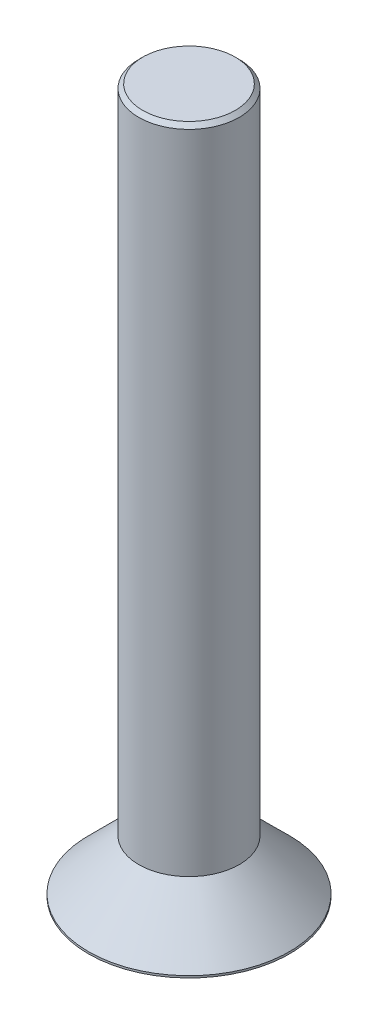
ISO-10303-21;
HEADER;
FILE_DESCRIPTION(('STEP AP214'),'2;1');
FILE_NAME('part.step','',(''),(''),'','','');
FILE_SCHEMA(('AUTOMOTIVE_DESIGN { 1 0 10303 214 1 1 1 1 }'));
ENDSEC;
DATA;
#1=APPLICATION_CONTEXT('core data for automotive mechanical design processes');
#2=APPLICATION_PROTOCOL_DEFINITION('international standard','automotive_design',2000,#1);
#3=PRODUCT_CONTEXT('',#1,'mechanical');
#4=PRODUCT('Part','Part','',(#3));
#5=PRODUCT_RELATED_PRODUCT_CATEGORY('part','',(#4));
#6=PRODUCT_DEFINITION_FORMATION('','',#4);
#7=PRODUCT_DEFINITION_CONTEXT('part definition',#1,'design');
#8=PRODUCT_DEFINITION('design','',#6,#7);
#9=PRODUCT_DEFINITION_SHAPE('','',#8);
#10=(LENGTH_UNIT() NAMED_UNIT(*) SI_UNIT(.MILLI.,.METRE.));
#11=(NAMED_UNIT(*) PLANE_ANGLE_UNIT() SI_UNIT($,.RADIAN.));
#12=(NAMED_UNIT(*) SI_UNIT($,.STERADIAN.) SOLID_ANGLE_UNIT());
#13=UNCERTAINTY_MEASURE_WITH_UNIT(LENGTH_MEASURE(1.E-05),#10,'distance_accuracy_value','');
#14=(GEOMETRIC_REPRESENTATION_CONTEXT(3) GLOBAL_UNCERTAINTY_ASSIGNED_CONTEXT((#13)) GLOBAL_UNIT_ASSIGNED_CONTEXT((#10,
#11,#12)) REPRESENTATION_CONTEXT('',''));
#15=CARTESIAN_POINT('',(0.,0.,0.));
#16=DIRECTION('',(0.,0.,1.));
#17=DIRECTION('',(1.,0.,0.));
#18=AXIS2_PLACEMENT_3D('',#15,#16,#17);
#19=CARTESIAN_POINT('',(0.,2.6,0.));
#20=DIRECTION('',(0.,-1.,0.));
#21=DIRECTION('',(0.,0.,-1.));
#22=AXIS2_PLACEMENT_3D('',#19,#20,#21);
#23=CYLINDRICAL_SURFACE('',#22,5.);
#24=CARTESIAN_POINT('',(0.,0.0999999999999916,0.));
#25=DIRECTION('',(0.,1.,0.));
#26=DIRECTION('',(0.,0.,1.));
#27=AXIS2_PLACEMENT_3D('',#24,#25,#26);
#28=CIRCLE('',#27,5.);
#29=CARTESIAN_POINT('',(0.,0.0999999999999916,5.));
#30=VERTEX_POINT('',#29);
#31=EDGE_CURVE('E151',#30,#30,#28,.F.);
#32=ORIENTED_EDGE('',*,*,#31,.T.);
#33=EDGE_LOOP('',(#32));
#34=FACE_BOUND('',#33,.T.);
#35=CARTESIAN_POINT('',(0.,0.,0.));
#36=DIRECTION('',(0.,1.,0.));
#37=DIRECTION('',(0.,0.,1.));
#38=AXIS2_PLACEMENT_3D('',#35,#36,#37);
#39=CIRCLE('',#38,5.);
#40=CARTESIAN_POINT('',(0.,0.,5.));
#41=VERTEX_POINT('',#40);
#42=EDGE_CURVE('E140',#41,#41,#39,.T.);
#43=ORIENTED_EDGE('',*,*,#42,.T.);
#44=EDGE_LOOP('',(#43));
#45=FACE_BOUND('',#44,.T.);
#46=ADVANCED_FACE('F37',(#34,#45),#23,.T.);
#47=CARTESIAN_POINT('',(0.,0.,0.));
#48=DIRECTION('',(0.,1.,0.));
#49=DIRECTION('',(0.,0.,1.));
#50=AXIS2_PLACEMENT_3D('',#47,#48,#49);
#51=PLANE('',#50);
#52=DIRECTION('',(0.,0.,1.));
#53=VECTOR('',#52,1.);
#54=CARTESIAN_POINT('',(1.54,0.,-0.889119414552024));
#55=LINE('',#54,#53);
#56=CARTESIAN_POINT('',(1.54,0.,-0.889119414552024));
#57=VERTEX_POINT('',#56);
#58=CARTESIAN_POINT('',(1.54,0.,0.889119414552024));
#59=VERTEX_POINT('',#58);
#60=EDGE_CURVE('E127',#57,#59,#55,.T.);
#61=ORIENTED_EDGE('',*,*,#60,.F.);
#62=DIRECTION('',(0.866025403784439,0.,0.5));
#63=VECTOR('',#62,1.);
#64=CARTESIAN_POINT('',(0.,0.,-1.77823882910405));
#65=LINE('',#64,#63);
#66=CARTESIAN_POINT('',(0.,0.,-1.77823882910405));
#67=VERTEX_POINT('',#66);
#68=EDGE_CURVE('E53',#67,#57,#65,.T.);
#69=ORIENTED_EDGE('',*,*,#68,.F.);
#70=DIRECTION('',(0.866025403784438,0.,-0.5));
#71=VECTOR('',#70,1.);
#72=CARTESIAN_POINT('',(-1.54,0.,-0.889119414552024));
#73=LINE('',#72,#71);
#74=CARTESIAN_POINT('',(-1.54,0.,-0.889119414552024));
#75=VERTEX_POINT('',#74);
#76=EDGE_CURVE('E136',#75,#67,#73,.T.);
#77=ORIENTED_EDGE('',*,*,#76,.F.);
#78=DIRECTION('',(0.,0.,-1.));
#79=VECTOR('',#78,1.);
#80=CARTESIAN_POINT('',(-1.54,0.,0.889119414552024));
#81=LINE('',#80,#79);
#82=CARTESIAN_POINT('',(-1.54,0.,0.889119414552024));
#83=VERTEX_POINT('',#82);
#84=EDGE_CURVE('E134',#83,#75,#81,.T.);
#85=ORIENTED_EDGE('',*,*,#84,.F.);
#86=DIRECTION('',(-0.866025403784439,0.,-0.5));
#87=VECTOR('',#86,1.);
#88=CARTESIAN_POINT('',(0.,0.,1.77823882910405));
#89=LINE('',#88,#87);
#90=CARTESIAN_POINT('',(0.,0.,1.77823882910405));
#91=VERTEX_POINT('',#90);
#92=EDGE_CURVE('E101',#91,#83,#89,.T.);
#93=ORIENTED_EDGE('',*,*,#92,.F.);
#94=DIRECTION('',(-0.866025403784439,0.,0.5));
#95=VECTOR('',#94,1.);
#96=CARTESIAN_POINT('',(1.54,0.,0.889119414552024));
#97=LINE('',#96,#95);
#98=EDGE_CURVE('E130',#59,#91,#97,.T.);
#99=ORIENTED_EDGE('',*,*,#98,.F.);
#100=EDGE_LOOP('',(#61,#69,#77,#85,#93,#99));
#101=FACE_BOUND('',#100,.T.);
#102=ORIENTED_EDGE('',*,*,#42,.F.);
#103=EDGE_LOOP('',(#102));
#104=FACE_BOUND('',#103,.T.);
#105=ADVANCED_FACE('F167',(#101,#104),#51,.F.);
#106=CARTESIAN_POINT('',(0.,2.6,0.));
#107=DIRECTION('',(0.,-1.,0.));
#108=DIRECTION('',(0.,0.,-1.));
#109=AXIS2_PLACEMENT_3D('',#106,#107,#108);
#110=CONICAL_SURFACE('',#109,2.5,0.785398163397447);
#111=ORIENTED_EDGE('',*,*,#31,.F.);
#112=EDGE_LOOP('',(#111));
#113=FACE_BOUND('',#112,.T.);
#114=CARTESIAN_POINT('',(0.,2.6,0.));
#115=DIRECTION('',(0.,1.,0.));
#116=DIRECTION('',(0.,0.,1.));
#117=AXIS2_PLACEMENT_3D('',#114,#115,#116);
#118=CIRCLE('',#117,2.5);
#119=CARTESIAN_POINT('',(0.,2.6,2.5));
#120=VERTEX_POINT('',#119);
#121=EDGE_CURVE('E148',#120,#120,#118,.T.);
#122=ORIENTED_EDGE('',*,*,#121,.F.);
#123=EDGE_LOOP('',(#122));
#124=FACE_BOUND('',#123,.T.);
#125=ADVANCED_FACE('F173',(#113,#124),#110,.T.);
#126=CARTESIAN_POINT('',(0.,0.95,-1.77823882910405));
#127=DIRECTION('',(0.5,0.,-0.866025403784439));
#128=DIRECTION('',(-0.866025403784439,0.,-0.5));
#129=AXIS2_PLACEMENT_3D('',#126,#127,#128);
#130=PLANE('',#129);
#131=ORIENTED_EDGE('',*,*,#68,.T.);
#132=DIRECTION('',(0.,-1.,0.));
#133=VECTOR('',#132,1.);
#134=CARTESIAN_POINT('',(1.54,0.95,-0.889119414552024));
#135=LINE('',#134,#133);
#136=CARTESIAN_POINT('',(1.54,0.95,-0.889119414552024));
#137=VERTEX_POINT('',#136);
#138=EDGE_CURVE('E83',#137,#57,#135,.T.);
#139=ORIENTED_EDGE('',*,*,#138,.F.);
#140=DIRECTION('',(0.866025403784439,0.,0.5));
#141=VECTOR('',#140,1.);
#142=CARTESIAN_POINT('',(0.,0.95,-1.77823882910405));
#143=LINE('',#142,#141);
#144=CARTESIAN_POINT('',(0.,0.95,-1.77823882910405));
#145=VERTEX_POINT('',#144);
#146=EDGE_CURVE('E138',#145,#137,#143,.T.);
#147=ORIENTED_EDGE('',*,*,#146,.F.);
#148=DIRECTION('',(0.,-1.,0.));
#149=VECTOR('',#148,1.);
#150=CARTESIAN_POINT('',(0.,0.95,-1.77823882910405));
#151=LINE('',#150,#149);
#152=EDGE_CURVE('E61',#145,#67,#151,.T.);
#153=ORIENTED_EDGE('',*,*,#152,.T.);
#154=EDGE_LOOP('',(#131,#139,#147,#153));
#155=FACE_BOUND('',#154,.T.);
#156=ADVANCED_FACE('F182',(#155),#130,.F.);
#157=CARTESIAN_POINT('',(-1.54,0.95,-0.889119414552024));
#158=DIRECTION('',(-0.5,0.,-0.866025403784439));
#159=DIRECTION('',(-0.866025403784439,0.,0.5));
#160=AXIS2_PLACEMENT_3D('',#157,#158,#159);
#161=PLANE('',#160);
#162=ORIENTED_EDGE('',*,*,#76,.T.);
#163=ORIENTED_EDGE('',*,*,#152,.F.);
#164=DIRECTION('',(0.866025403784438,0.,-0.5));
#165=VECTOR('',#164,1.);
#166=CARTESIAN_POINT('',(-1.54,0.95,-0.889119414552024));
#167=LINE('',#166,#165);
#168=CARTESIAN_POINT('',(-1.54,0.95,-0.889119414552024));
#169=VERTEX_POINT('',#168);
#170=EDGE_CURVE('E113',#169,#145,#167,.T.);
#171=ORIENTED_EDGE('',*,*,#170,.F.);
#172=DIRECTION('',(0.,-1.,0.));
#173=VECTOR('',#172,1.);
#174=CARTESIAN_POINT('',(-1.54,0.95,-0.889119414552024));
#175=LINE('',#174,#173);
#176=EDGE_CURVE('E105',#169,#75,#175,.T.);
#177=ORIENTED_EDGE('',*,*,#176,.T.);
#178=EDGE_LOOP('',(#162,#163,#171,#177));
#179=FACE_BOUND('',#178,.T.);
#180=ADVANCED_FACE('F187',(#179),#161,.F.);
#181=CARTESIAN_POINT('',(-1.54,0.95,0.889119414552024));
#182=DIRECTION('',(-1.,0.,0.));
#183=DIRECTION('',(0.,0.,1.));
#184=AXIS2_PLACEMENT_3D('',#181,#182,#183);
#185=PLANE('',#184);
#186=ORIENTED_EDGE('',*,*,#84,.T.);
#187=ORIENTED_EDGE('',*,*,#176,.F.);
#188=DIRECTION('',(0.,0.,-1.));
#189=VECTOR('',#188,1.);
#190=CARTESIAN_POINT('',(-1.54,0.95,0.889119414552024));
#191=LINE('',#190,#189);
#192=CARTESIAN_POINT('',(-1.54,0.95,0.889119414552024));
#193=VERTEX_POINT('',#192);
#194=EDGE_CURVE('E109',#193,#169,#191,.T.);
#195=ORIENTED_EDGE('',*,*,#194,.F.);
#196=DIRECTION('',(0.,-1.,0.));
#197=VECTOR('',#196,1.);
#198=CARTESIAN_POINT('',(-1.54,0.95,0.889119414552024));
#199=LINE('',#198,#197);
#200=EDGE_CURVE('E94',#193,#83,#199,.T.);
#201=ORIENTED_EDGE('',*,*,#200,.T.);
#202=EDGE_LOOP('',(#186,#187,#195,#201));
#203=FACE_BOUND('',#202,.T.);
#204=ADVANCED_FACE('F110',(#203),#185,.F.);
#205=CARTESIAN_POINT('',(0.,0.95,1.77823882910405));
#206=DIRECTION('',(-0.5,0.,0.866025403784439));
#207=DIRECTION('',(0.866025403784439,0.,0.5));
#208=AXIS2_PLACEMENT_3D('',#205,#206,#207);
#209=PLANE('',#208);
#210=ORIENTED_EDGE('',*,*,#92,.T.);
#211=ORIENTED_EDGE('',*,*,#200,.F.);
#212=DIRECTION('',(-0.866025403784439,0.,-0.5));
#213=VECTOR('',#212,1.);
#214=CARTESIAN_POINT('',(0.,0.95,1.77823882910405));
#215=LINE('',#214,#213);
#216=CARTESIAN_POINT('',(0.,0.95,1.77823882910405));
#217=VERTEX_POINT('',#216);
#218=EDGE_CURVE('E98',#217,#193,#215,.T.);
#219=ORIENTED_EDGE('',*,*,#218,.F.);
#220=DIRECTION('',(0.,-1.,0.));
#221=VECTOR('',#220,1.);
#222=CARTESIAN_POINT('',(0.,0.95,1.77823882910405));
#223=LINE('',#222,#221);
#224=EDGE_CURVE('E106',#217,#91,#223,.T.);
#225=ORIENTED_EDGE('',*,*,#224,.T.);
#226=EDGE_LOOP('',(#210,#211,#219,#225));
#227=FACE_BOUND('',#226,.T.);
#228=ADVANCED_FACE('F96',(#227),#209,.F.);
#229=CARTESIAN_POINT('',(1.54,0.95,0.889119414552024));
#230=DIRECTION('',(0.5,0.,0.866025403784439));
#231=DIRECTION('',(0.866025403784439,0.,-0.5));
#232=AXIS2_PLACEMENT_3D('',#229,#230,#231);
#233=PLANE('',#232);
#234=ORIENTED_EDGE('',*,*,#98,.T.);
#235=ORIENTED_EDGE('',*,*,#224,.F.);
#236=DIRECTION('',(-0.866025403784439,0.,0.5));
#237=VECTOR('',#236,1.);
#238=CARTESIAN_POINT('',(1.54,0.95,0.889119414552024));
#239=LINE('',#238,#237);
#240=CARTESIAN_POINT('',(1.54,0.95,0.889119414552024));
#241=VERTEX_POINT('',#240);
#242=EDGE_CURVE('E119',#241,#217,#239,.T.);
#243=ORIENTED_EDGE('',*,*,#242,.F.);
#244=DIRECTION('',(0.,-1.,0.));
#245=VECTOR('',#244,1.);
#246=CARTESIAN_POINT('',(1.54,0.95,0.889119414552024));
#247=LINE('',#246,#245);
#248=EDGE_CURVE('E143',#241,#59,#247,.T.);
#249=ORIENTED_EDGE('',*,*,#248,.T.);
#250=EDGE_LOOP('',(#234,#235,#243,#249));
#251=FACE_BOUND('',#250,.T.);
#252=ADVANCED_FACE('F207',(#251),#233,.F.);
#253=CARTESIAN_POINT('',(1.54,0.95,-0.889119414552024));
#254=DIRECTION('',(1.,0.,0.));
#255=DIRECTION('',(0.,0.,-1.));
#256=AXIS2_PLACEMENT_3D('',#253,#254,#255);
#257=PLANE('',#256);
#258=ORIENTED_EDGE('',*,*,#60,.T.);
#259=ORIENTED_EDGE('',*,*,#248,.F.);
#260=DIRECTION('',(0.,0.,1.));
#261=VECTOR('',#260,1.);
#262=CARTESIAN_POINT('',(1.54,0.95,-0.889119414552024));
#263=LINE('',#262,#261);
#264=EDGE_CURVE('E121',#137,#241,#263,.T.);
#265=ORIENTED_EDGE('',*,*,#264,.F.);
#266=ORIENTED_EDGE('',*,*,#138,.T.);
#267=EDGE_LOOP('',(#258,#259,#265,#266));
#268=FACE_BOUND('',#267,.T.);
#269=ADVANCED_FACE('F198',(#268),#257,.F.);
#270=CARTESIAN_POINT('',(0.,0.95,0.));
#271=DIRECTION('',(0.,-1.,0.));
#272=DIRECTION('',(0.,0.,-1.));
#273=AXIS2_PLACEMENT_3D('',#270,#271,#272);
#274=PLANE('',#273);
#275=ORIENTED_EDGE('',*,*,#146,.T.);
#276=ORIENTED_EDGE('',*,*,#264,.T.);
#277=ORIENTED_EDGE('',*,*,#242,.T.);
#278=ORIENTED_EDGE('',*,*,#218,.T.);
#279=ORIENTED_EDGE('',*,*,#194,.T.);
#280=ORIENTED_EDGE('',*,*,#170,.T.);
#281=EDGE_LOOP('',(#275,#276,#277,#278,#279,#280));
#282=FACE_BOUND('',#281,.T.);
#283=ADVANCED_FACE('F116',(#282),#274,.T.);
#284=CARTESIAN_POINT('',(0.,35.,0.));
#285=DIRECTION('',(0.,-1.,0.));
#286=DIRECTION('',(0.,0.,-1.));
#287=AXIS2_PLACEMENT_3D('',#284,#285,#286);
#288=CYLINDRICAL_SURFACE('',#287,2.5);
#289=CARTESIAN_POINT('',(0.,34.8,0.));
#290=DIRECTION('',(0.,1.,0.));
#291=DIRECTION('',(0.,0.,1.));
#292=AXIS2_PLACEMENT_3D('',#289,#290,#291);
#293=CIRCLE('',#292,2.5);
#294=CARTESIAN_POINT('',(0.,34.8,2.5));
#295=VERTEX_POINT('',#294);
#296=EDGE_CURVE('E11',#295,#295,#293,.F.);
#297=ORIENTED_EDGE('',*,*,#296,.T.);
#298=EDGE_LOOP('',(#297));
#299=FACE_BOUND('',#298,.T.);
#300=ORIENTED_EDGE('',*,*,#121,.T.);
#301=EDGE_LOOP('',(#300));
#302=FACE_BOUND('',#301,.T.);
#303=ADVANCED_FACE('F163',(#299,#302),#288,.T.);
#304=CARTESIAN_POINT('',(0.,35.,0.));
#305=DIRECTION('',(0.,1.,0.));
#306=DIRECTION('',(0.,0.,1.));
#307=AXIS2_PLACEMENT_3D('',#304,#305,#306);
#308=PLANE('',#307);
#309=CARTESIAN_POINT('',(0.,35.,0.));
#310=DIRECTION('',(0.,1.,0.));
#311=DIRECTION('',(0.,0.,1.));
#312=AXIS2_PLACEMENT_3D('',#309,#310,#311);
#313=CIRCLE('',#312,2.30000000000001);
#314=CARTESIAN_POINT('',(0.,35.,2.30000000000001));
#315=VERTEX_POINT('',#314);
#316=EDGE_CURVE('E46',#315,#315,#313,.T.);
#317=ORIENTED_EDGE('',*,*,#316,.T.);
#318=EDGE_LOOP('',(#317));
#319=FACE_BOUND('',#318,.T.);
#320=ADVANCED_FACE('F156',(#319),#308,.T.);
#321=CARTESIAN_POINT('',(0.,35.,0.));
#322=DIRECTION('',(0.,-1.,0.));
#323=DIRECTION('',(0.,0.,-1.));
#324=AXIS2_PLACEMENT_3D('',#321,#322,#323);
#325=CONICAL_SURFACE('',#324,2.30000000000001,0.785398163397434);
#326=ORIENTED_EDGE('',*,*,#296,.F.);
#327=EDGE_LOOP('',(#326));
#328=FACE_BOUND('',#327,.T.);
#329=ORIENTED_EDGE('',*,*,#316,.F.);
#330=EDGE_LOOP('',(#329));
#331=FACE_BOUND('',#330,.T.);
#332=ADVANCED_FACE('F40',(#328,#331),#325,.T.);
#333=CLOSED_SHELL('',(#46,#105,#125,#156,#180,#204,#228,#252,#269,#283,#303,#320,#332));
#334=MANIFOLD_SOLID_BREP('B2',#333);
#335=ADVANCED_BREP_SHAPE_REPRESENTATION('',(#18,#334),#14);
#336=SHAPE_DEFINITION_REPRESENTATION(#9,#335);
ENDSEC;
END-ISO-10303-21;
